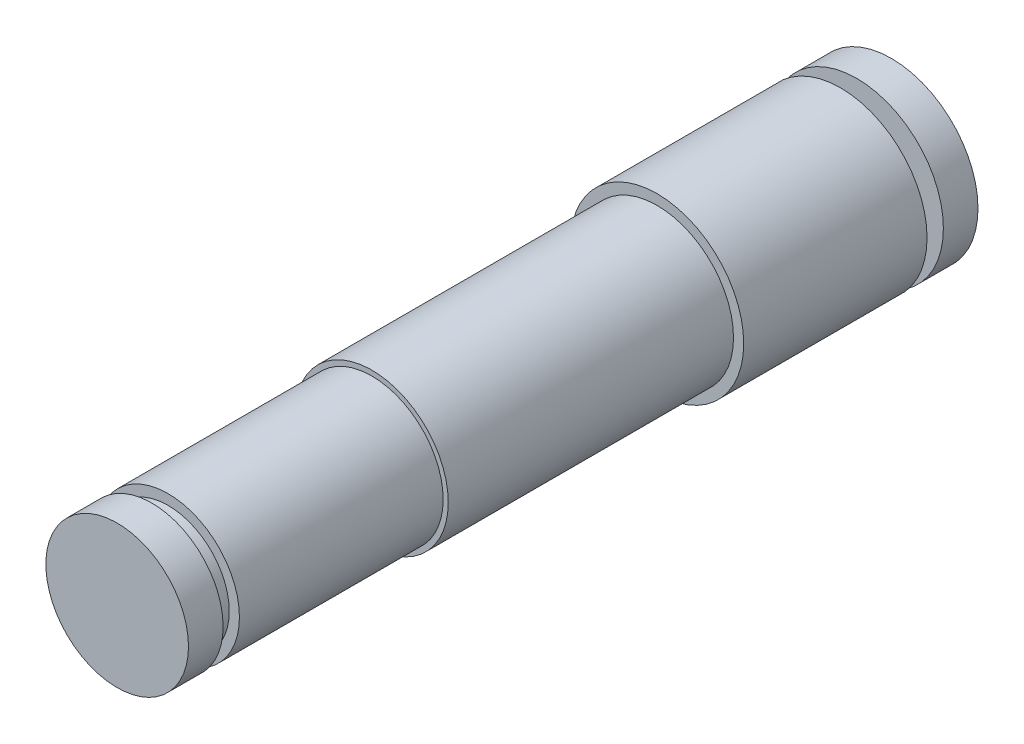
ISO-10303-21;
HEADER;
FILE_DESCRIPTION(('STEP AP214'),'2;1');
FILE_NAME('part.step','',(''),(''),'','','');
FILE_SCHEMA(('AUTOMOTIVE_DESIGN { 1 0 10303 214 1 1 1 1 }'));
ENDSEC;
DATA;
#1=APPLICATION_CONTEXT('core data for automotive mechanical design processes');
#2=APPLICATION_PROTOCOL_DEFINITION('international standard','automotive_design',2000,#1);
#3=PRODUCT_CONTEXT('',#1,'mechanical');
#4=PRODUCT('Part','Part','',(#3));
#5=PRODUCT_RELATED_PRODUCT_CATEGORY('part','',(#4));
#6=PRODUCT_DEFINITION_FORMATION('','',#4);
#7=PRODUCT_DEFINITION_CONTEXT('part definition',#1,'design');
#8=PRODUCT_DEFINITION('design','',#6,#7);
#9=PRODUCT_DEFINITION_SHAPE('','',#8);
#10=(LENGTH_UNIT() NAMED_UNIT(*) SI_UNIT(.MILLI.,.METRE.));
#11=(NAMED_UNIT(*) PLANE_ANGLE_UNIT() SI_UNIT($,.RADIAN.));
#12=(NAMED_UNIT(*) SI_UNIT($,.STERADIAN.) SOLID_ANGLE_UNIT());
#13=UNCERTAINTY_MEASURE_WITH_UNIT(LENGTH_MEASURE(1.E-05),#10,'distance_accuracy_value','');
#14=(GEOMETRIC_REPRESENTATION_CONTEXT(3) GLOBAL_UNCERTAINTY_ASSIGNED_CONTEXT((#13)) GLOBAL_UNIT_ASSIGNED_CONTEXT((#10,
#11,#12)) REPRESENTATION_CONTEXT('',''));
#15=CARTESIAN_POINT('',(0.,0.,0.));
#16=DIRECTION('',(0.,0.,1.));
#17=DIRECTION('',(1.,0.,0.));
#18=AXIS2_PLACEMENT_3D('',#15,#16,#17);
#19=CARTESIAN_POINT('',(0.,0.,0.));
#20=DIRECTION('',(0.,0.,1.));
#21=DIRECTION('',(1.,0.,0.));
#22=AXIS2_PLACEMENT_3D('',#19,#20,#21);
#23=PLANE('',#22);
#24=CARTESIAN_POINT('',(0.,0.,1.11022302462516E-13));
#25=DIRECTION('',(0.,0.,1.));
#26=DIRECTION('',(1.,0.,0.));
#27=AXIS2_PLACEMENT_3D('',#24,#25,#26);
#28=CIRCLE('',#27,35.);
#29=CARTESIAN_POINT('',(35.,0.,0.));
#30=VERTEX_POINT('',#29);
#31=EDGE_CURVE('E10',#30,#30,#28,.T.);
#32=ORIENTED_EDGE('',*,*,#31,.T.);
#33=EDGE_LOOP('',(#32));
#34=FACE_BOUND('',#33,.T.);
#35=ADVANCED_FACE('F30',(#34),#23,.T.);
#36=CARTESIAN_POINT('',(3.49148336110938E-12,0.,1000.));
#37=DIRECTION('',(0.,0.,1.));
#38=DIRECTION('',(1.,0.,0.));
#39=AXIS2_PLACEMENT_3D('',#36,#37,#38);
#40=CYLINDRICAL_SURFACE('',#39,35.);
#41=CARTESIAN_POINT('',(0.,0.,-16.9999999999997));
#42=DIRECTION('',(0.,0.,1.));
#43=DIRECTION('',(1.,0.,0.));
#44=AXIS2_PLACEMENT_3D('',#41,#42,#43);
#45=CIRCLE('',#44,35.0000000000001);
#46=CARTESIAN_POINT('',(35.,0.,-16.9999999999998));
#47=VERTEX_POINT('',#46);
#48=EDGE_CURVE('E36',#47,#47,#45,.T.);
#49=ORIENTED_EDGE('',*,*,#48,.T.);
#50=EDGE_LOOP('',(#49));
#51=FACE_BOUND('',#50,.T.);
#52=ORIENTED_EDGE('',*,*,#31,.F.);
#53=EDGE_LOOP('',(#52));
#54=FACE_BOUND('',#53,.T.);
#55=ADVANCED_FACE('F92',(#51,#54),#40,.T.);
#56=CARTESIAN_POINT('',(35.,0.,-17.));
#57=DIRECTION('',(0.,0.,-1.));
#58=DIRECTION('',(-1.,0.,0.));
#59=AXIS2_PLACEMENT_3D('',#56,#57,#58);
#60=PLANE('',#59);
#61=CARTESIAN_POINT('',(0.,0.,-16.9999999999999));
#62=DIRECTION('',(0.,0.,1.));
#63=DIRECTION('',(1.,0.,0.));
#64=AXIS2_PLACEMENT_3D('',#61,#62,#63);
#65=CIRCLE('',#64,30.0000000000001);
#66=CARTESIAN_POINT('',(30.,0.,-17.));
#67=VERTEX_POINT('',#66);
#68=EDGE_CURVE('E40',#67,#67,#65,.T.);
#69=ORIENTED_EDGE('',*,*,#68,.T.);
#70=EDGE_LOOP('',(#69));
#71=FACE_BOUND('',#70,.T.);
#72=ORIENTED_EDGE('',*,*,#48,.F.);
#73=EDGE_LOOP('',(#72));
#74=FACE_BOUND('',#73,.T.);
#75=ADVANCED_FACE('F96',(#71,#74),#60,.T.);
#76=CARTESIAN_POINT('',(3.49148336110938E-12,0.,1000.));
#77=DIRECTION('',(0.,0.,1.));
#78=DIRECTION('',(1.,0.,0.));
#79=AXIS2_PLACEMENT_3D('',#76,#77,#78);
#80=CYLINDRICAL_SURFACE('',#79,30.0000000000001);
#81=CARTESIAN_POINT('',(0.,0.,-24.9999999999999));
#82=DIRECTION('',(0.,0.,1.));
#83=DIRECTION('',(1.,0.,0.));
#84=AXIS2_PLACEMENT_3D('',#81,#82,#83);
#85=CIRCLE('',#84,30.0000000000001);
#86=CARTESIAN_POINT('',(30.,0.,-25.));
#87=VERTEX_POINT('',#86);
#88=EDGE_CURVE('E44',#87,#87,#85,.T.);
#89=ORIENTED_EDGE('',*,*,#88,.T.);
#90=EDGE_LOOP('',(#89));
#91=FACE_BOUND('',#90,.T.);
#92=ORIENTED_EDGE('',*,*,#68,.F.);
#93=EDGE_LOOP('',(#92));
#94=FACE_BOUND('',#93,.T.);
#95=ADVANCED_FACE('F100',(#91,#94),#80,.T.);
#96=CARTESIAN_POINT('',(30.,0.,-25.));
#97=DIRECTION('',(0.,0.,1.));
#98=DIRECTION('',(1.,0.,0.));
#99=AXIS2_PLACEMENT_3D('',#96,#97,#98);
#100=PLANE('',#99);
#101=CARTESIAN_POINT('',(0.,0.,-24.9999999999997));
#102=DIRECTION('',(0.,0.,1.));
#103=DIRECTION('',(1.,0.,0.));
#104=AXIS2_PLACEMENT_3D('',#101,#102,#103);
#105=CIRCLE('',#104,35.0000000000001);
#106=CARTESIAN_POINT('',(35.,0.,-24.9999999999998));
#107=VERTEX_POINT('',#106);
#108=EDGE_CURVE('E49',#107,#107,#105,.T.);
#109=ORIENTED_EDGE('',*,*,#108,.T.);
#110=EDGE_LOOP('',(#109));
#111=FACE_BOUND('',#110,.T.);
#112=ORIENTED_EDGE('',*,*,#88,.F.);
#113=EDGE_LOOP('',(#112));
#114=FACE_BOUND('',#113,.T.);
#115=ADVANCED_FACE('F107',(#111,#114),#100,.T.);
#116=CARTESIAN_POINT('',(3.49148336110938E-12,0.,1000.));
#117=DIRECTION('',(0.,0.,1.));
#118=DIRECTION('',(1.,0.,0.));
#119=AXIS2_PLACEMENT_3D('',#116,#117,#118);
#120=CYLINDRICAL_SURFACE('',#119,35.0000000000003);
#121=CARTESIAN_POINT('',(-4.36435420138672E-13,0.,-125.));
#122=DIRECTION('',(0.,0.,1.));
#123=DIRECTION('',(1.,0.,0.));
#124=AXIS2_PLACEMENT_3D('',#121,#122,#123);
#125=CIRCLE('',#124,35.0000000000004);
#126=CARTESIAN_POINT('',(35.,0.,-125.));
#127=VERTEX_POINT('',#126);
#128=EDGE_CURVE('E52',#127,#127,#125,.T.);
#129=ORIENTED_EDGE('',*,*,#128,.T.);
#130=EDGE_LOOP('',(#129));
#131=FACE_BOUND('',#130,.T.);
#132=ORIENTED_EDGE('',*,*,#108,.F.);
#133=EDGE_LOOP('',(#132));
#134=FACE_BOUND('',#133,.T.);
#135=ADVANCED_FACE('F111',(#131,#134),#120,.T.);
#136=CARTESIAN_POINT('',(35.,0.,-125.));
#137=DIRECTION('',(0.,0.,1.));
#138=DIRECTION('',(1.,0.,0.));
#139=AXIS2_PLACEMENT_3D('',#136,#137,#138);
#140=PLANE('',#139);
#141=CARTESIAN_POINT('',(-4.36435420138672E-13,0.,-125.));
#142=DIRECTION('',(0.,0.,1.));
#143=DIRECTION('',(1.,0.,0.));
#144=AXIS2_PLACEMENT_3D('',#141,#142,#143);
#145=CIRCLE('',#144,37.5000000000004);
#146=CARTESIAN_POINT('',(37.5,0.,-125.));
#147=VERTEX_POINT('',#146);
#148=EDGE_CURVE('E55',#147,#147,#145,.T.);
#149=ORIENTED_EDGE('',*,*,#148,.T.);
#150=EDGE_LOOP('',(#149));
#151=FACE_BOUND('',#150,.T.);
#152=ORIENTED_EDGE('',*,*,#128,.F.);
#153=EDGE_LOOP('',(#152));
#154=FACE_BOUND('',#153,.T.);
#155=ADVANCED_FACE('F115',(#151,#154),#140,.T.);
#156=CARTESIAN_POINT('',(3.49148336110938E-12,0.,1000.));
#157=DIRECTION('',(0.,0.,1.));
#158=DIRECTION('',(1.,0.,0.));
#159=AXIS2_PLACEMENT_3D('',#156,#157,#158);
#160=CYLINDRICAL_SURFACE('',#159,37.5000000000007);
#161=CARTESIAN_POINT('',(-9.25243090693986E-13,0.,-265.));
#162=DIRECTION('',(0.,0.,1.));
#163=DIRECTION('',(1.,0.,0.));
#164=AXIS2_PLACEMENT_3D('',#161,#162,#163);
#165=CIRCLE('',#164,37.5000000000009);
#166=CARTESIAN_POINT('',(37.5,0.,-265.));
#167=VERTEX_POINT('',#166);
#168=EDGE_CURVE('E58',#167,#167,#165,.T.);
#169=ORIENTED_EDGE('',*,*,#168,.T.);
#170=EDGE_LOOP('',(#169));
#171=FACE_BOUND('',#170,.T.);
#172=ORIENTED_EDGE('',*,*,#148,.F.);
#173=EDGE_LOOP('',(#172));
#174=FACE_BOUND('',#173,.T.);
#175=ADVANCED_FACE('F119',(#171,#174),#160,.T.);
#176=CARTESIAN_POINT('',(37.5,0.,-265.));
#177=DIRECTION('',(0.,0.,1.));
#178=DIRECTION('',(1.,0.,0.));
#179=AXIS2_PLACEMENT_3D('',#176,#177,#178);
#180=PLANE('',#179);
#181=CARTESIAN_POINT('',(-9.25243090693986E-13,0.,-265.));
#182=DIRECTION('',(0.,0.,1.));
#183=DIRECTION('',(1.,0.,0.));
#184=AXIS2_PLACEMENT_3D('',#181,#182,#183);
#185=CIRCLE('',#184,42.5000000000009);
#186=CARTESIAN_POINT('',(42.5,0.,-265.));
#187=VERTEX_POINT('',#186);
#188=EDGE_CURVE('E61',#187,#187,#185,.T.);
#189=ORIENTED_EDGE('',*,*,#188,.T.);
#190=EDGE_LOOP('',(#189));
#191=FACE_BOUND('',#190,.T.);
#192=ORIENTED_EDGE('',*,*,#168,.F.);
#193=EDGE_LOOP('',(#192));
#194=FACE_BOUND('',#193,.T.);
#195=ADVANCED_FACE('F123',(#191,#194),#180,.T.);
#196=CARTESIAN_POINT('',(3.49148336110938E-12,0.,1000.));
#197=DIRECTION('',(0.,0.,1.));
#198=DIRECTION('',(1.,0.,0.));
#199=AXIS2_PLACEMENT_3D('',#196,#197,#198);
#200=CYLINDRICAL_SURFACE('',#199,42.5000000000011);
#201=CARTESIAN_POINT('',(-1.23947659319383E-12,0.,-355.));
#202=DIRECTION('',(0.,0.,1.));
#203=DIRECTION('',(1.,0.,0.));
#204=AXIS2_PLACEMENT_3D('',#201,#202,#203);
#205=CIRCLE('',#204,42.5000000000012);
#206=CARTESIAN_POINT('',(42.5,0.,-355.));
#207=VERTEX_POINT('',#206);
#208=EDGE_CURVE('E64',#207,#207,#205,.T.);
#209=ORIENTED_EDGE('',*,*,#208,.T.);
#210=EDGE_LOOP('',(#209));
#211=FACE_BOUND('',#210,.T.);
#212=ORIENTED_EDGE('',*,*,#188,.F.);
#213=EDGE_LOOP('',(#212));
#214=FACE_BOUND('',#213,.T.);
#215=ADVANCED_FACE('F127',(#211,#214),#200,.T.);
#216=CARTESIAN_POINT('',(42.5,0.,-355.));
#217=DIRECTION('',(0.,0.,-1.));
#218=DIRECTION('',(-1.,0.,0.));
#219=AXIS2_PLACEMENT_3D('',#216,#217,#218);
#220=PLANE('',#219);
#221=CARTESIAN_POINT('',(-1.23947659319383E-12,0.,-355.));
#222=DIRECTION('',(0.,0.,1.));
#223=DIRECTION('',(1.,0.,0.));
#224=AXIS2_PLACEMENT_3D('',#221,#222,#223);
#225=CIRCLE('',#224,30.5000000000012);
#226=CARTESIAN_POINT('',(30.5,0.,-355.));
#227=VERTEX_POINT('',#226);
#228=EDGE_CURVE('E67',#227,#227,#225,.T.);
#229=ORIENTED_EDGE('',*,*,#228,.T.);
#230=EDGE_LOOP('',(#229));
#231=FACE_BOUND('',#230,.T.);
#232=ORIENTED_EDGE('',*,*,#208,.F.);
#233=EDGE_LOOP('',(#232));
#234=FACE_BOUND('',#233,.T.);
#235=ADVANCED_FACE('F131',(#231,#234),#220,.T.);
#236=CARTESIAN_POINT('',(3.49148336110938E-12,0.,1000.));
#237=DIRECTION('',(0.,0.,1.));
#238=DIRECTION('',(1.,0.,0.));
#239=AXIS2_PLACEMENT_3D('',#236,#237,#238);
#240=CYLINDRICAL_SURFACE('',#239,30.5000000000013);
#241=CARTESIAN_POINT('',(-1.26740846008271E-12,0.,-363.));
#242=DIRECTION('',(0.,0.,1.));
#243=DIRECTION('',(1.,0.,0.));
#244=AXIS2_PLACEMENT_3D('',#241,#242,#243);
#245=CIRCLE('',#244,30.5000000000013);
#246=CARTESIAN_POINT('',(30.5,0.,-363.));
#247=VERTEX_POINT('',#246);
#248=EDGE_CURVE('E70',#247,#247,#245,.T.);
#249=ORIENTED_EDGE('',*,*,#248,.T.);
#250=EDGE_LOOP('',(#249));
#251=FACE_BOUND('',#250,.T.);
#252=ORIENTED_EDGE('',*,*,#228,.F.);
#253=EDGE_LOOP('',(#252));
#254=FACE_BOUND('',#253,.T.);
#255=ADVANCED_FACE('F135',(#251,#254),#240,.T.);
#256=CARTESIAN_POINT('',(30.5,0.,-363.));
#257=DIRECTION('',(0.,0.,1.));
#258=DIRECTION('',(1.,0.,0.));
#259=AXIS2_PLACEMENT_3D('',#256,#257,#258);
#260=PLANE('',#259);
#261=CARTESIAN_POINT('',(-1.26740846008271E-12,0.,-363.));
#262=DIRECTION('',(0.,0.,1.));
#263=DIRECTION('',(1.,0.,0.));
#264=AXIS2_PLACEMENT_3D('',#261,#262,#263);
#265=CIRCLE('',#264,42.5000000000013);
#266=CARTESIAN_POINT('',(42.5,0.,-363.));
#267=VERTEX_POINT('',#266);
#268=EDGE_CURVE('E73',#267,#267,#265,.T.);
#269=ORIENTED_EDGE('',*,*,#268,.T.);
#270=EDGE_LOOP('',(#269));
#271=FACE_BOUND('',#270,.T.);
#272=ORIENTED_EDGE('',*,*,#248,.F.);
#273=EDGE_LOOP('',(#272));
#274=FACE_BOUND('',#273,.T.);
#275=ADVANCED_FACE('F89',(#271,#274),#260,.T.);
#276=CARTESIAN_POINT('',(3.49148336110938E-12,0.,1000.));
#277=DIRECTION('',(0.,0.,1.));
#278=DIRECTION('',(1.,0.,0.));
#279=AXIS2_PLACEMENT_3D('',#276,#277,#278);
#280=CYLINDRICAL_SURFACE('',#279,42.5000000000013);
#281=CARTESIAN_POINT('',(-1.32676367722156E-12,0.,-380.));
#282=DIRECTION('',(0.,0.,1.));
#283=DIRECTION('',(1.,0.,0.));
#284=AXIS2_PLACEMENT_3D('',#281,#282,#283);
#285=CIRCLE('',#284,42.5000000000013);
#286=CARTESIAN_POINT('',(42.5,0.,-380.));
#287=VERTEX_POINT('',#286);
#288=EDGE_CURVE('E76',#287,#287,#285,.T.);
#289=ORIENTED_EDGE('',*,*,#288,.T.);
#290=EDGE_LOOP('',(#289));
#291=FACE_BOUND('',#290,.T.);
#292=ORIENTED_EDGE('',*,*,#268,.F.);
#293=EDGE_LOOP('',(#292));
#294=FACE_BOUND('',#293,.T.);
#295=ADVANCED_FACE('F80',(#291,#294),#280,.T.);
#296=CARTESIAN_POINT('',(42.5,0.,-379.999999999999));
#297=DIRECTION('',(0.,0.,-1.));
#298=DIRECTION('',(-1.,0.,0.));
#299=AXIS2_PLACEMENT_3D('',#296,#297,#298);
#300=PLANE('',#299);
#301=ORIENTED_EDGE('',*,*,#288,.F.);
#302=EDGE_LOOP('',(#301));
#303=FACE_BOUND('',#302,.T.);
#304=ADVANCED_FACE('F83',(#303),#300,.T.);
#305=CLOSED_SHELL('',(#35,#55,#75,#95,#115,#135,#155,#175,#195,#215,#235,#255,#275,#295,#304));
#306=MANIFOLD_SOLID_BREP('B2',#305);
#307=ADVANCED_BREP_SHAPE_REPRESENTATION('',(#18,#306),#14);
#308=SHAPE_DEFINITION_REPRESENTATION(#9,#307);
ENDSEC;
END-ISO-10303-21;
